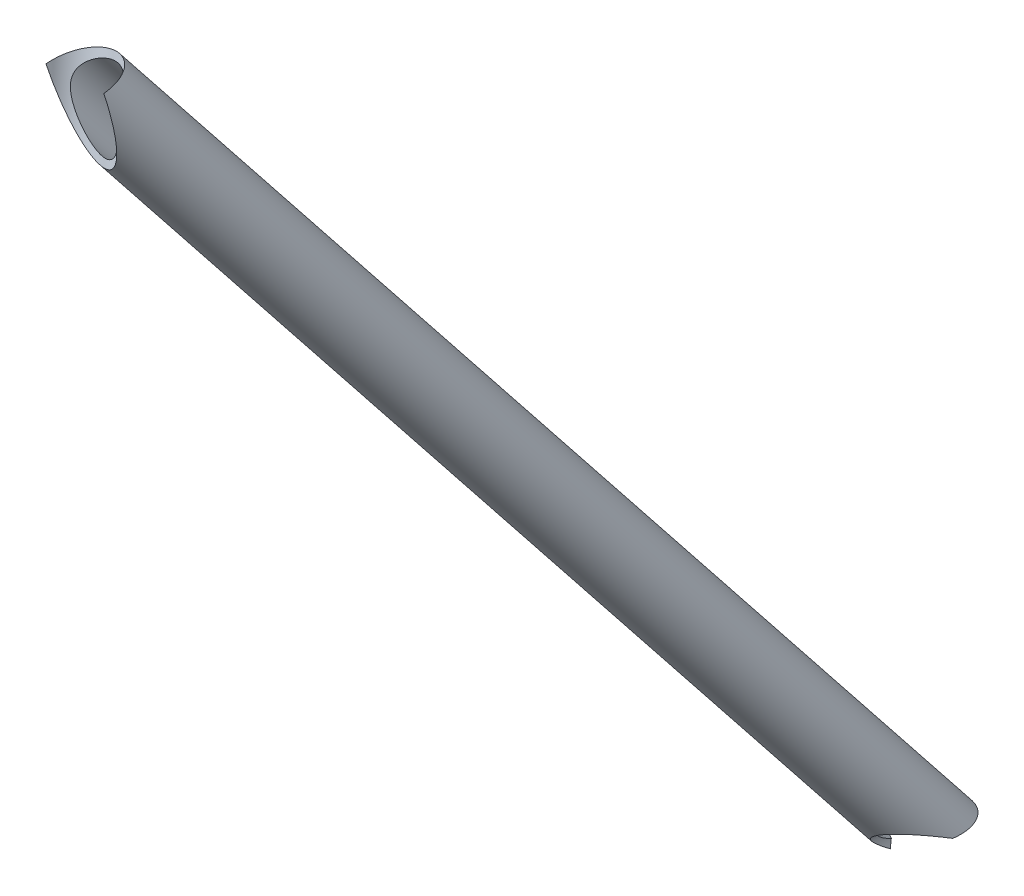
ISO-10303-21;
HEADER;
FILE_DESCRIPTION(('STEP AP214'),'2;1');
FILE_NAME('part.step','',(''),(''),'','','');
FILE_SCHEMA(('AUTOMOTIVE_DESIGN { 1 0 10303 214 1 1 1 1 }'));
ENDSEC;
DATA;
#1=APPLICATION_CONTEXT('core data for automotive mechanical design processes');
#2=APPLICATION_PROTOCOL_DEFINITION('international standard','automotive_design',2000,#1);
#3=PRODUCT_CONTEXT('',#1,'mechanical');
#4=PRODUCT('Part','Part','',(#3));
#5=PRODUCT_RELATED_PRODUCT_CATEGORY('part','',(#4));
#6=PRODUCT_DEFINITION_FORMATION('','',#4);
#7=PRODUCT_DEFINITION_CONTEXT('part definition',#1,'design');
#8=PRODUCT_DEFINITION('design','',#6,#7);
#9=PRODUCT_DEFINITION_SHAPE('','',#8);
#10=(LENGTH_UNIT() NAMED_UNIT(*) SI_UNIT(.MILLI.,.METRE.));
#11=(NAMED_UNIT(*) PLANE_ANGLE_UNIT() SI_UNIT($,.RADIAN.));
#12=(NAMED_UNIT(*) SI_UNIT($,.STERADIAN.) SOLID_ANGLE_UNIT());
#13=UNCERTAINTY_MEASURE_WITH_UNIT(LENGTH_MEASURE(1.E-05),#10,'distance_accuracy_value','');
#14=(GEOMETRIC_REPRESENTATION_CONTEXT(3) GLOBAL_UNCERTAINTY_ASSIGNED_CONTEXT((#13)) GLOBAL_UNIT_ASSIGNED_CONTEXT((#10,
#11,#12)) REPRESENTATION_CONTEXT('',''));
#15=CARTESIAN_POINT('',(0.,0.,0.));
#16=DIRECTION('',(0.,0.,1.));
#17=DIRECTION('',(1.,0.,0.));
#18=AXIS2_PLACEMENT_3D('',#15,#16,#17);
#19=CARTESIAN_POINT('',(250.000000000002,220.000000000001,-2000.));
#20=DIRECTION('',(-0.220873286514712,0.785327240941148,0.578339101168124));
#21=DIRECTION('',(0.,-0.592984323970814,0.805214003557363));
#22=AXIS2_PLACEMENT_3D('',#19,#20,#21);
#23=CYLINDRICAL_SURFACE('',#22,7.90000000000002);
#24=CARTESIAN_POINT('',(186.642858966305,440.585258627095,-1827.74318398322));
#25=CARTESIAN_POINT('',(186.752428093397,440.605161627123,-1827.72852719438));
#26=CARTESIAN_POINT('',(186.860994969299,440.630064497735,-1827.71317177304));
#27=CARTESIAN_POINT('',(187.07526867984,440.68955100044,-1827.68120657467));
#28=CARTESIAN_POINT('',(187.180974465447,440.724138131963,-1827.66459634582));
#29=CARTESIAN_POINT('',(187.492691346244,440.841693097054,-1827.61312517711));
#30=CARTESIAN_POINT('',(187.693347526773,440.938463025471,-1827.57661761688));
#31=CARTESIAN_POINT('',(188.122282758854,441.189402713712,-1827.4916226761));
#32=CARTESIAN_POINT('',(188.345514707554,441.351793041307,-1827.44237262172));
#33=CARTESIAN_POINT('',(188.76238209019,441.710458701126,-1827.34190864548));
#34=CARTESIAN_POINT('',(188.955954418355,441.906804441614,-1827.29069081849));
#35=CARTESIAN_POINT('',(189.280328319921,442.282079806857,-1827.19805233085));
#36=CARTESIAN_POINT('',(189.416002710456,442.456907681934,-1827.15667426444));
#37=CARTESIAN_POINT('',(189.671458997917,442.817986799844,-1827.0742492467));
#38=CARTESIAN_POINT('',(189.791230414787,443.004245458522,-1827.0332025303));
#39=CARTESIAN_POINT('',(190.016683336826,443.385460485637,-1826.95180289924));
#40=CARTESIAN_POINT('',(190.122348517796,443.580426588469,-1826.91145083467));
#41=CARTESIAN_POINT('',(190.321101399643,443.976915569887,-1826.83174161313));
#42=CARTESIAN_POINT('',(190.414184223835,444.178440953391,-1826.79238484671));
#43=CARTESIAN_POINT('',(190.586835745881,444.581156361001,-1826.71590996645));
#44=CARTESIAN_POINT('',(190.666694522571,444.782216949459,-1826.67876021794));
#45=CARTESIAN_POINT('',(190.816858261714,445.188059978178,-1826.60579541799));
#46=CARTESIAN_POINT('',(190.887164547591,445.392841898412,-1826.56998018216));
#47=CARTESIAN_POINT('',(191.019224980943,445.805595299622,-1826.49980724706));
#48=CARTESIAN_POINT('',(191.080971067105,446.013569584976,-1826.46545094253));
#49=CARTESIAN_POINT('',(191.196611597481,446.431963748182,-1826.3983980348));
#50=CARTESIAN_POINT('',(191.250505121511,446.642383909534,-1826.36570162641));
#51=CARTESIAN_POINT('',(191.40196464391,447.278945076008,-1826.27002114591));
#52=CARTESIAN_POINT('',(191.488606648467,447.708133373777,-1826.20983108325));
#53=CARTESIAN_POINT('',(191.636896026196,448.571647283601,-1826.09874281159));
#54=CARTESIAN_POINT('',(191.698557965261,449.005969749409,-1826.04783919721));
#55=CARTESIAN_POINT('',(191.777848498178,449.689899606742,-1825.97734724358));
#56=CARTESIAN_POINT('',(191.802991981959,449.938250615632,-1825.95373042853));
#57=CARTESIAN_POINT('',(191.846463748032,450.435951762374,-1825.91100203436));
#58=CARTESIAN_POINT('',(191.864791807766,450.685301932586,-1825.89189060238));
#59=CARTESIAN_POINT('',(191.894900482616,451.185115160938,-1825.85898282421));
#60=CARTESIAN_POINT('',(191.906671545637,451.435579309672,-1825.84519424116));
#61=CARTESIAN_POINT('',(191.923752217785,451.936997115486,-1825.82405460314));
#62=CARTESIAN_POINT('',(191.929062150724,452.187950747402,-1825.81670322555));
#63=CARTESIAN_POINT('',(191.933196444197,452.688032524648,-1825.80987028865));
#64=CARTESIAN_POINT('',(191.932072187403,452.937159268125,-1825.81032643757));
#65=CARTESIAN_POINT('',(191.923280107894,453.435186210419,-1825.82075087455));
#66=CARTESIAN_POINT('',(191.91561078373,453.684086344135,-1825.83072134527));
#67=CARTESIAN_POINT('',(191.893356060565,454.180226765289,-1825.8624721546));
#68=CARTESIAN_POINT('',(191.878788242715,454.427469660925,-1825.88422249177));
#69=CARTESIAN_POINT('',(191.842059061676,454.919581551793,-1825.94247168153));
#70=CARTESIAN_POINT('',(191.81990289174,455.164452053079,-1825.97896045061));
#71=CARTESIAN_POINT('',(191.775189258917,455.573923011248,-1826.05602691041));
#72=CARTESIAN_POINT('',(191.754923464304,455.739681562544,-1826.09175859526));
#73=CARTESIAN_POINT('',(191.709792355637,456.068148188384,-1826.17321203258));
#74=CARTESIAN_POINT('',(191.684926695434,456.230856032341,-1826.21893453692));
#75=CARTESIAN_POINT('',(191.630093862643,456.551377407496,-1826.32146851241));
#76=CARTESIAN_POINT('',(191.600141424792,456.709203560939,-1826.3782480228));
#77=CARTESIAN_POINT('',(191.534438093945,457.018707171362,-1826.50396071448));
#78=CARTESIAN_POINT('',(191.498688638488,457.170386141089,-1826.57289088303));
#79=CARTESIAN_POINT('',(191.426917298777,457.442239649155,-1826.71140113961));
#80=CARTESIAN_POINT('',(191.391836634665,457.563597217977,-1826.77914666357));
#81=CARTESIAN_POINT('',(191.31675654061,457.799416115064,-1826.92335938107));
#82=CARTESIAN_POINT('',(191.276757651573,457.913878199635,-1826.99982561545));
#83=CARTESIAN_POINT('',(191.191547338536,458.134946631106,-1827.16089112805));
#84=CARTESIAN_POINT('',(191.146333768461,458.241549713875,-1827.24549375236));
#85=CARTESIAN_POINT('',(191.0505233585,458.446136265069,-1827.42177927405));
#86=CARTESIAN_POINT('',(190.999926204699,458.544119230248,-1827.51346258421));
#87=CARTESIAN_POINT('',(190.893496183813,458.730696016765,-1827.70218343829));
#88=CARTESIAN_POINT('',(190.837687269535,458.819329157464,-1827.79919571789));
#89=CARTESIAN_POINT('',(190.72063263225,458.987698272343,-1827.99753701967));
#90=CARTESIAN_POINT('',(190.659386945841,459.067434306404,-1828.09886601279));
#91=CARTESIAN_POINT('',(190.531416862332,459.218373906312,-1828.30458178351));
#92=CARTESIAN_POINT('',(190.464686275678,459.289567603294,-1828.40897192771));
#93=CARTESIAN_POINT('',(190.325861513536,459.423780351402,-1828.61944069093));
#94=CARTESIAN_POINT('',(190.253766080016,459.486797475596,-1828.72551970138));
#95=CARTESIAN_POINT('',(190.071510723227,459.631147696164,-1828.98486450651));
#96=CARTESIAN_POINT('',(189.958520540455,459.708397699271,-1829.13842760681));
#97=CARTESIAN_POINT('',(189.72187837651,459.848724190113,-1829.44382514406));
#98=CARTESIAN_POINT('',(189.598222555494,459.911795543529,-1829.59565893598));
#99=CARTESIAN_POINT('',(189.34047580179,460.025305643242,-1829.89539680413));
#100=CARTESIAN_POINT('',(189.206374681417,460.075731848834,-1830.04329685021));
#101=CARTESIAN_POINT('',(188.92825607424,460.165141546437,-1830.33306202265));
#102=CARTESIAN_POINT('',(188.784239561336,460.20412616028,-1830.47492773948));
#103=CARTESIAN_POINT('',(188.48447663721,460.272222088195,-1830.75310693114));
#104=CARTESIAN_POINT('',(188.328584900256,460.301173862112,-1830.88930282558));
#105=CARTESIAN_POINT('',(188.007634390643,460.349251122525,-1831.15230606339));
#106=CARTESIAN_POINT('',(187.842575485993,460.368376467496,-1831.27911327151));
#107=CARTESIAN_POINT('',(187.504045154702,460.397503633442,-1831.52197072124));
#108=CARTESIAN_POINT('',(187.330576794119,460.407508753659,-1831.63802483911));
#109=CARTESIAN_POINT('',(186.975982975714,460.418982509829,-1831.85824995431));
#110=CARTESIAN_POINT('',(186.794857478529,460.420451101893,-1831.96242089054));
#111=CARTESIAN_POINT('',(186.412428566776,460.415141725747,-1832.16495740433));
#112=CARTESIAN_POINT('',(186.210616026598,460.407755774126,-1832.262348633));
#113=CARTESIAN_POINT('',(185.800514768925,460.384204944894,-1832.44115284055));
#114=CARTESIAN_POINT('',(185.59222571243,460.368039607013,-1832.52256498139));
#115=CARTESIAN_POINT('',(185.17058194869,460.327358617794,-1832.66850631995));
#116=CARTESIAN_POINT('',(184.957226758818,460.302842167893,-1832.73303390206));
#117=CARTESIAN_POINT('',(184.527018672459,460.245843010005,-1832.84449935656));
#118=CARTESIAN_POINT('',(184.310165905461,460.21336059631,-1832.89143787858));
#119=CARTESIAN_POINT('',(183.880813829899,460.141811437137,-1832.96618294119));
#120=CARTESIAN_POINT('',(183.668367043396,460.102959209749,-1832.99449755499));
#121=CARTESIAN_POINT('',(183.243254440462,460.01834447876,-1833.0338904696));
#122=CARTESIAN_POINT('',(183.030588627774,459.972582091369,-1833.04496906022));
#123=CARTESIAN_POINT('',(182.606636186311,459.874397863477,-1833.04990420065));
#124=CARTESIAN_POINT('',(182.395349350116,459.821977049967,-1833.04376340329));
#125=CARTESIAN_POINT('',(181.975679402989,459.710663422325,-1833.01449700923));
#126=CARTESIAN_POINT('',(181.767296298213,459.651770594471,-1832.99137137652));
#127=CARTESIAN_POINT('',(181.356461518591,459.528090714676,-1832.92880468245));
#128=CARTESIAN_POINT('',(181.153977778499,459.46334952741,-1832.8894832123));
#129=CARTESIAN_POINT('',(180.754833116257,459.327652123196,-1832.79516223278));
#130=CARTESIAN_POINT('',(180.558172180235,459.256695921057,-1832.74016276077));
#131=CARTESIAN_POINT('',(180.171981690002,459.108458564598,-1832.61526472582));
#132=CARTESIAN_POINT('',(179.982455691425,459.031174316099,-1832.54535884708));
#133=CARTESIAN_POINT('',(179.612000606068,458.870095053704,-1832.39165610984));
#134=CARTESIAN_POINT('',(179.431071588284,458.786299987568,-1832.30785913987));
#135=CARTESIAN_POINT('',(179.073868586318,458.609186217959,-1832.12484602267));
#136=CARTESIAN_POINT('',(178.897896900505,458.515657275658,-1832.02524284387));
#137=CARTESIAN_POINT('',(178.557946768245,458.320587948659,-1831.81405835545));
#138=CARTESIAN_POINT('',(178.393969811074,458.219046572374,-1831.70247556265));
#139=CARTESIAN_POINT('',(178.079617659338,458.007032032474,-1831.46920725414));
#140=CARTESIAN_POINT('',(177.929238341606,457.896561595761,-1831.34752482252));
#141=CARTESIAN_POINT('',(177.643715106251,457.665400369748,-1831.09627771351));
#142=CARTESIAN_POINT('',(177.508566258001,457.544712910336,-1830.96671560807));
#143=CARTESIAN_POINT('',(177.289091758784,457.325311175641,-1830.73775104678));
#144=CARTESIAN_POINT('',(177.200820639719,457.229313217939,-1830.63951345762));
#145=CARTESIAN_POINT('',(177.034253314478,457.030325262109,-1830.44169291567));
#146=CARTESIAN_POINT('',(176.95595445116,456.927337137796,-1830.34211032912));
#147=CARTESIAN_POINT('',(176.81027178925,456.713942918263,-1830.14337918577));
#148=CARTESIAN_POINT('',(176.74286744085,456.603551358012,-1830.04423016331));
#149=CARTESIAN_POINT('',(176.619572580637,456.374733484093,-1829.84801829283));
#150=CARTESIAN_POINT('',(176.563681985917,456.256307228288,-1829.75095542977));
#151=CARTESIAN_POINT('',(176.463525089334,456.010029853818,-1829.55992891086));
#152=CARTESIAN_POINT('',(176.419385867028,455.882093448389,-1829.46600804184));
#153=CARTESIAN_POINT('',(176.343841083295,455.618288824543,-1829.2843895339));
#154=CARTESIAN_POINT('',(176.312434319414,455.482421356522,-1829.19669130797));
#155=CARTESIAN_POINT('',(176.262219611295,455.203674517758,-1829.02924436516));
#156=CARTESIAN_POINT('',(176.243409649362,455.060796273905,-1828.94949437692));
#157=CARTESIAN_POINT('',(176.217736464523,454.769320545757,-1828.79905356782));
#158=CARTESIAN_POINT('',(176.210874697655,454.620722366671,-1828.72836385204));
#159=CARTESIAN_POINT('',(176.207900083172,454.303096391433,-1828.58938626054));
#160=CARTESIAN_POINT('',(176.213021800671,454.133589423054,-1828.52217314513));
#161=CARTESIAN_POINT('',(176.234908760222,453.791286656262,-1828.39905336804));
#162=CARTESIAN_POINT('',(176.251676552492,453.618490145578,-1828.34314918621));
#163=CARTESIAN_POINT('',(176.29516909483,453.270769556212,-1828.24155997147));
#164=CARTESIAN_POINT('',(176.32191689158,453.095841466698,-1828.19589898691));
#165=CARTESIAN_POINT('',(176.383833020134,452.745297771199,-1828.11366818849));
#166=CARTESIAN_POINT('',(176.419005280715,452.569681882155,-1828.07710263259));
#167=CARTESIAN_POINT('',(176.495379780514,452.223666821107,-1828.01271410454));
#168=CARTESIAN_POINT('',(176.536379171063,452.053263077795,-1827.98466966503));
#169=CARTESIAN_POINT('',(176.624201888152,451.713094101329,-1827.93482347983));
#170=CARTESIAN_POINT('',(176.671024310789,451.543328773279,-1827.91302076697));
#171=CARTESIAN_POINT('',(176.769847170013,451.20455033451,-1827.87464499769));
#172=CARTESIAN_POINT('',(176.821852573148,451.03553811061,-1827.85807702204));
#173=CARTESIAN_POINT('',(176.930486513364,450.698619749656,-1827.82935483573));
#174=CARTESIAN_POINT('',(176.987115625698,450.530713753049,-1827.81720117529));
#175=CARTESIAN_POINT('',(177.16395416973,450.027092755485,-1827.7861443965));
#176=CARTESIAN_POINT('',(177.290582268134,449.693273067514,-1827.77283281665));
#177=CARTESIAN_POINT('',(177.55881620358,449.03172310243,-1827.75653061142));
#178=CARTESIAN_POINT('',(177.700415070275,448.703990074221,-1827.75353520449));
#179=CARTESIAN_POINT('',(177.97261129307,448.110111169178,-1827.75457256744));
#180=CARTESIAN_POINT('',(178.101001438905,447.842947202599,-1827.75749950363));
#181=CARTESIAN_POINT('',(178.367512472577,447.313548514546,-1827.76688093592));
#182=CARTESIAN_POINT('',(178.505634270515,447.051314257011,-1827.77333576234));
#183=CARTESIAN_POINT('',(178.791953158901,446.532014593434,-1827.78865633965));
#184=CARTESIAN_POINT('',(178.94016348694,446.274956575271,-1827.79752530583));
#185=CARTESIAN_POINT('',(179.246882083768,445.767125468946,-1827.8167197384));
#186=CARTESIAN_POINT('',(179.405389670923,445.516351966295,-1827.82704510844));
#187=CARTESIAN_POINT('',(179.7319862024,445.024073199504,-1827.84822199712));
#188=CARTESIAN_POINT('',(179.899986413564,444.782509006585,-1827.85906853516));
#189=CARTESIAN_POINT('',(180.247576701284,444.307755132984,-1827.88058850042));
#190=CARTESIAN_POINT('',(180.427168891376,444.074566991619,-1827.89126189563));
#191=CARTESIAN_POINT('',(180.798545643458,443.618867640966,-1827.91162210433));
#192=CARTESIAN_POINT('',(180.990302927331,443.396334379432,-1827.92131100664));
#193=CARTESIAN_POINT('',(181.387545483843,442.963890909218,-1827.93887530518));
#194=CARTESIAN_POINT('',(181.593023046664,442.753973735135,-1827.94675170903));
#195=CARTESIAN_POINT('',(181.926538400246,442.437928834734,-1827.95688848704));
#196=CARTESIAN_POINT('',(182.049403786919,442.326356548642,-1827.96010169939));
#197=CARTESIAN_POINT('',(182.300301329639,442.109123852956,-1827.96542459375));
#198=CARTESIAN_POINT('',(182.42833345134,442.003463404073,-1827.96753428309));
#199=CARTESIAN_POINT('',(182.690050483792,441.798879031254,-1827.9704187369));
#200=CARTESIAN_POINT('',(182.823744433493,441.699966592122,-1827.97119127749));
#201=CARTESIAN_POINT('',(183.096829825542,441.510297305192,-1827.97112692867));
#202=CARTESIAN_POINT('',(183.236221337259,441.419540556733,-1827.97029001966));
#203=CARTESIAN_POINT('',(183.522734273044,441.246551921303,-1827.96668053804));
#204=CARTESIAN_POINT('',(183.669933485407,441.164448486642,-1827.96388254111));
#205=CARTESIAN_POINT('',(183.970341056391,441.012043864408,-1827.9559731305));
#206=CARTESIAN_POINT('',(184.123550246751,440.941744317569,-1827.95086139558));
#207=CARTESIAN_POINT('',(184.435192874333,440.815371288616,-1827.93797012179));
#208=CARTESIAN_POINT('',(184.593611053662,440.759259827326,-1827.93019783909));
#209=CARTESIAN_POINT('',(184.915182547543,440.663531831656,-1827.9116227321));
#210=CARTESIAN_POINT('',(185.078332843981,440.623905020616,-1827.90082180296));
#211=CARTESIAN_POINT('',(185.358855081219,440.572588531476,-1827.87960937101));
#212=CARTESIAN_POINT('',(185.475420483615,440.556095989463,-1827.87003628917));
#213=CARTESIAN_POINT('',(185.70938011646,440.533248401992,-1827.84919525914));
#214=CARTESIAN_POINT('',(185.826774069146,440.52689010751,-1827.83792785541));
#215=CARTESIAN_POINT('',(186.061360934894,440.524901183724,-1827.81369998508));
#216=CARTESIAN_POINT('',(186.178553927816,440.52925890918,-1827.80074137084));
#217=CARTESIAN_POINT('',(186.411818739849,440.548995870663,-1827.7731728686));
#218=CARTESIAN_POINT('',(186.527890583619,440.564374863716,-1827.75856301701));
#219=CARTESIAN_POINT('',(186.642858966305,440.585258627095,-1827.74318398322));
#220=B_SPLINE_CURVE_WITH_KNOTS('',3,(#24,#25,#26,#27,#28,#29,#30,#31,#32,#33,#34,#35,#36,#37,
#38,#39,#40,#41,#42,#43,#44,#45,#46,#47,#48,#49,#50,#51,#52,#53,#54,#55,#56,#57,#58,#59,#60,#61,
#62,#63,#64,#65,#66,#67,#68,#69,#70,#71,#72,#73,#74,#75,#76,#77,#78,#79,#80,#81,#82,#83,#84,#85,
#86,#87,#88,#89,#90,#91,#92,#93,#94,#95,#96,#97,#98,#99,#100,#101,#102,#103,#104,#105,#106,#107,
#108,#109,#110,#111,#112,#113,#114,#115,#116,#117,#118,#119,#120,#121,#122,#123,#124,#125,#126,
#127,#128,#129,#130,#131,#132,#133,#134,#135,#136,#137,#138,#139,#140,#141,#142,#143,#144,#145,
#146,#147,#148,#149,#150,#151,#152,#153,#154,#155,#156,#157,#158,#159,#160,#161,#162,#163,#164,
#165,#166,#167,#168,#169,#170,#171,#172,#173,#174,#175,#176,#177,#178,#179,#180,#181,#182,#183,
#184,#185,#186,#187,#188,#189,#190,#191,#192,#193,#194,#195,#196,#197,#198,#199,#200,#201,#202,
#203,#204,#205,#206,#207,#208,#209,#210,#211,#212,#213,#214,#215,#216,#217,#218,#219),
.UNSPECIFIED.,.T.,.F.,(4,2,2,2,2,2,2,2,2,2,2,2,2,2,2,2,2,2,2,2,2,2,2,2,2,2,2,2,2,2,2,2,2,2,2,2,
2,2,2,2,2,2,2,2,2,2,2,2,2,2,2,2,2,2,2,2,2,2,2,2,2,2,2,2,2,2,2,2,2,2,2,2,2,2,2,2,2,2,2,2,2,2,2,2,
2,2,2,2,2,2,2,2,2,2,2,2,2,4),(0.,0.336840989323387,0.673803854309978,1.34759135190776,
2.18424726716013,3.02265930048108,3.69713046898443,4.37204393082849,5.04773177676874,
5.72368076031018,6.38192735394287,7.04008265941308,7.69885361293995,8.35770170108503,
9.6825560321899,11.006636724007,11.7587263785664,12.5108405904088,13.2640476201482,
14.01721689997,14.7643798963346,15.511714339159,16.257154330341,17.0020851795604,
17.5140905159853,18.0261343975515,18.5367195931108,19.0471783672481,19.4767323542733,
19.9062391412155,20.3359233246091,20.7656325765667,21.1934559411627,21.6212764261042,
22.0495865029481,22.4779973349059,23.0942381699182,23.7107017974741,24.3277744003737,
24.9447864799412,25.5712027492475,26.1976280402872,26.8238266317871,27.4500284427923,
28.1218066818187,28.7936201430302,29.4654978634875,30.137350766136,30.790017577673,
31.4426734143248,32.095228707772,32.7477853847514,33.395607545099,34.0434281619442,
34.6915674525793,35.339711944067,36.007292881715,36.6749565665391,37.3424171141943,
38.009660957377,38.4990736632176,38.9883556892365,39.4767037545551,39.9650483032875,
40.4584770499629,40.9518591863692,41.4451622762421,41.9385254771169,42.4849155357643,
43.031425278852,43.579204959793,44.1272405987518,44.6594919946155,45.1916608724288,
45.7243446914621,46.2570948852017,47.328238149135,48.3988848698922,49.2879471888221,
50.177092763356,51.0674283922845,51.9577051446897,52.8407176074603,53.7238915249486,
54.6051506579685,55.4859186872294,55.9837507879408,56.4815795798068,56.9802355412719,
57.4788975757878,57.984147002715,58.4894666010458,58.993418869918,59.4970564984764,
59.8510016882762,60.2048333809435,60.5582807300142,60.9117202872412),.UNSPECIFIED.);
#221=CARTESIAN_POINT('',(186.642858966305,440.585258627095,-1827.74318398322));
#222=VERTEX_POINT('',#221);
#223=EDGE_CURVE('E111',#222,#222,#220,.T.);
#224=ORIENTED_EDGE('',*,*,#223,.T.);
#225=EDGE_LOOP('',(#224));
#226=FACE_BOUND('',#225,.T.);
#227=CARTESIAN_POINT('',(245.807312143982,230.222758439814,-1982.66059030163));
#228=CARTESIAN_POINT('',(245.624410447176,229.998344097819,-1982.82585276794));
#229=CARTESIAN_POINT('',(245.452957899156,229.77439989533,-1983.00426039845));
#230=CARTESIAN_POINT('',(245.128924377079,229.329186195667,-1983.38071745754));
#231=CARTESIAN_POINT('',(244.976362792528,229.107919653515,-1983.57878669715));
#232=CARTESIAN_POINT('',(244.68633497429,228.667994216839,-1983.99122163359));
#233=CARTESIAN_POINT('',(244.548958124841,228.449356884022,-1984.20567243438));
#234=CARTESIAN_POINT('',(244.287840277746,228.01666355135,-1984.64681958413));
#235=CARTESIAN_POINT('',(244.164093290487,227.802605572699,-1984.8735104884));
#236=CARTESIAN_POINT('',(243.921637739096,227.367696857351,-1985.35007679693));
#237=CARTESIAN_POINT('',(243.80358791348,227.147126609061,-1985.60054089134));
#238=CARTESIAN_POINT('',(243.578476079433,226.711964157807,-1986.11146425207));
#239=CARTESIAN_POINT('',(243.471416369794,226.497373212339,-1986.37192559392));
#240=CARTESIAN_POINT('',(243.266587547917,226.074493138244,-1986.90225336215));
#241=CARTESIAN_POINT('',(243.168834662204,225.866215432555,-1987.17213513302));
#242=CARTESIAN_POINT('',(242.981507055761,225.457229555957,-1987.72028714));
#243=CARTESIAN_POINT('',(242.891931493626,225.256520607512,-1987.99855650914));
#244=CARTESIAN_POINT('',(242.71999271249,224.864373279645,-1988.56257683179));
#245=CARTESIAN_POINT('',(242.637611203844,224.672911979097,-1988.84830626255));
#246=CARTESIAN_POINT('',(242.478700164398,224.300383300671,-1989.42815729349));
#247=CARTESIAN_POINT('',(242.402171812205,224.119318017981,-1989.72228056758));
#248=CARTESIAN_POINT('',(242.254116007919,223.77053100784,-1990.31872477327));
#249=CARTESIAN_POINT('',(242.182578395252,223.602782067709,-1990.62102720041));
#250=CARTESIAN_POINT('',(242.043389540983,223.284018782331,-1991.23512322047));
#251=CARTESIAN_POINT('',(241.975736332427,223.132995930827,-1991.54691188526));
#252=CARTESIAN_POINT('',(241.866194795075,222.901395553901,-1992.07227264414));
#253=CARTESIAN_POINT('',(241.823430888273,222.814426893828,-1992.28283770838));
#254=CARTESIAN_POINT('',(241.739099254348,222.652500456568,-1992.70888227772));
#255=CARTESIAN_POINT('',(241.69753177973,222.577545199739,-1992.92436280326));
#256=CARTESIAN_POINT('',(241.615818896484,222.442903074455,-1993.35947009389));
#257=CARTESIAN_POINT('',(241.575668807538,222.383160900979,-1993.5790786311));
#258=CARTESIAN_POINT('',(241.497032277611,222.282311120361,-1994.02284071867));
#259=CARTESIAN_POINT('',(241.45854491899,222.241193112778,-1994.24699165913));
#260=CARTESIAN_POINT('',(241.396337623587,222.191479286646,-1994.62496080986));
#261=CARTESIAN_POINT('',(241.371899739251,222.176647820829,-1994.77784196466));
#262=CARTESIAN_POINT('',(241.324710360892,222.158596838594,-1995.08452974639));
#263=CARTESIAN_POINT('',(241.301958266095,222.15537316575,-1995.23833602231));
#264=CARTESIAN_POINT('',(241.258812788155,222.161587827185,-1995.54587500464));
#265=CARTESIAN_POINT('',(241.238416812678,222.171012098558,-1995.69960760298));
#266=CARTESIAN_POINT('',(241.200765295529,222.203151127582,-1996.00608231863));
#267=CARTESIAN_POINT('',(241.183509702691,222.225865668667,-1996.15882445204));
#268=CARTESIAN_POINT('',(241.152974369996,222.284795213137,-1996.46280647461));
#269=CARTESIAN_POINT('',(241.139712689075,222.32106992327,-1996.61403663698));
#270=CARTESIAN_POINT('',(241.118188189392,222.406543497247,-1996.91315747085));
#271=CARTESIAN_POINT('',(241.10992542735,222.455742507723,-1997.06104810444));
#272=CARTESIAN_POINT('',(241.099222934395,222.566032725547,-1997.35280149343));
#273=CARTESIAN_POINT('',(241.096792666454,222.627143085131,-1997.4966573294));
#274=CARTESIAN_POINT('',(241.098471307309,222.759715381203,-1997.77947023266));
#275=CARTESIAN_POINT('',(241.102581104961,222.831178723555,-1997.91842663145));
#276=CARTESIAN_POINT('',(241.119390892364,222.997852303446,-1998.21813264608));
#277=CARTESIAN_POINT('',(241.13363262241,223.094961461707,-1998.37774009978));
#278=CARTESIAN_POINT('',(241.172905362533,223.29888542536,-1998.68923133161));
#279=CARTESIAN_POINT('',(241.197938760517,223.405702374694,-1998.84111339201));
#280=CARTESIAN_POINT('',(241.259203041516,223.626574907862,-1999.1373457416));
#281=CARTESIAN_POINT('',(241.295443866893,223.740636847214,-1999.2816892097));
#282=CARTESIAN_POINT('',(241.37931724949,223.973670805667,-1999.5628714048));
#283=CARTESIAN_POINT('',(241.426949291501,224.092642602502,-1999.69971047086));
#284=CARTESIAN_POINT('',(241.534672045184,224.335819707672,-1999.96855603688));
#285=CARTESIAN_POINT('',(241.594978139845,224.460081209685,-2000.10042518905));
#286=CARTESIAN_POINT('',(241.727450408546,224.709948177971,-2000.35670946677));
#287=CARTESIAN_POINT('',(241.799616531795,224.835553638486,-2000.48112462424));
#288=CARTESIAN_POINT('',(241.955660950714,225.086550126954,-2000.72252897153));
#289=CARTESIAN_POINT('',(242.039536298277,225.211941200866,-2000.83952001981));
#290=CARTESIAN_POINT('',(242.218794720544,225.461193341735,-2001.06608502021));
#291=CARTESIAN_POINT('',(242.314178384025,225.585054330053,-2001.17565859239));
#292=CARTESIAN_POINT('',(242.531968807456,225.849220739282,-2001.40385789128));
#293=CARTESIAN_POINT('',(242.656268523652,225.989066096806,-2001.52121659629));
#294=CARTESIAN_POINT('',(242.91925124868,226.263428505782,-2001.74562239388));
#295=CARTESIAN_POINT('',(243.057935610429,226.397945054397,-2001.8526685147));
#296=CARTESIAN_POINT('',(243.348957003794,226.660203187838,-2002.0561340557));
#297=CARTESIAN_POINT('',(243.501298505471,226.787942532509,-2002.15254997337));
#298=CARTESIAN_POINT('',(243.81865910206,227.035280685873,-2002.3343151419));
#299=CARTESIAN_POINT('',(243.983677872882,227.154879702523,-2002.41966467553));
#300=CARTESIAN_POINT('',(244.32583856651,227.385151845903,-2002.57912055417));
#301=CARTESIAN_POINT('',(244.503016032378,227.495796547017,-2002.65319170497));
#302=CARTESIAN_POINT('',(244.86781114807,227.706779040902,-2002.78934291321));
#303=CARTESIAN_POINT('',(245.05542889957,227.807116733268,-2002.85142285385));
#304=CARTESIAN_POINT('',(245.439717983171,227.99668721028,-2002.96315808781));
#305=CARTESIAN_POINT('',(245.636388008455,228.085921590995,-2003.01281516792));
#306=CARTESIAN_POINT('',(246.037345315893,228.252719389216,-2003.09931047411));
#307=CARTESIAN_POINT('',(246.241632514585,228.330282934554,-2003.13614884061));
#308=CARTESIAN_POINT('',(246.653497888212,228.472407893981,-2003.19621688096));
#309=CARTESIAN_POINT('',(246.86099502949,228.53712992402,-2003.21962266026));
#310=CARTESIAN_POINT('',(247.28037040048,228.654709911369,-2003.25323029953));
#311=CARTESIAN_POINT('',(247.492248603865,228.70756793995,-2003.26343223882));
#312=CARTESIAN_POINT('',(247.918866627575,228.801504110585,-2003.27028079517));
#313=CARTESIAN_POINT('',(248.133607114182,228.842579457927,-2003.26692419915));
#314=CARTESIAN_POINT('',(248.564303660048,228.913235684803,-2003.2462776504));
#315=CARTESIAN_POINT('',(248.780259722865,228.942816530683,-2003.22898765688));
#316=CARTESIAN_POINT('',(249.214687422478,228.991355438234,-2003.17972726281));
#317=CARTESIAN_POINT('',(249.433153591979,229.010164461905,-2003.14756153008));
#318=CARTESIAN_POINT('',(249.867964457336,229.037384934472,-2003.06797338859));
#319=CARTESIAN_POINT('',(250.084308992019,229.045795599415,-2003.02054982985));
#320=CARTESIAN_POINT('',(250.513072980222,229.053390964558,-2002.90981875144));
#321=CARTESIAN_POINT('',(250.725492283611,229.052575312601,-2002.84651062557));
#322=CARTESIAN_POINT('',(251.144456196129,229.043271034301,-2002.7032516687));
#323=CARTESIAN_POINT('',(251.351002022333,229.034784009714,-2002.62330431459));
#324=CARTESIAN_POINT('',(251.715900066539,229.014417751188,-2002.46348941358));
#325=CARTESIAN_POINT('',(251.875684575118,229.003545432161,-2002.38675216765));
#326=CARTESIAN_POINT('',(252.188875430056,228.979486234647,-2002.22153579599));
#327=CARTESIAN_POINT('',(252.342282995456,228.966299801074,-2002.13305892813));
#328=CARTESIAN_POINT('',(252.641111934178,228.939180498787,-2001.94407829473));
#329=CARTESIAN_POINT('',(252.786545760259,228.925248865239,-2001.84359410973));
#330=CARTESIAN_POINT('',(253.068136970845,228.898404653474,-2001.63023588294));
#331=CARTESIAN_POINT('',(253.204296162632,228.885491876641,-2001.51736426625));
#332=CARTESIAN_POINT('',(253.444428961392,228.864491255573,-2001.29871797514));
#333=CARTESIAN_POINT('',(253.550034587178,228.855960198979,-2001.19477713663));
#334=CARTESIAN_POINT('',(253.752660076463,228.842120535598,-2000.97865266732));
#335=CARTESIAN_POINT('',(253.849681728209,228.836811256282,-2000.86647076228));
#336=CARTESIAN_POINT('',(254.0342715413,228.830448725444,-2000.63462644792));
#337=CARTESIAN_POINT('',(254.121848239454,228.829391598707,-2000.51497095076));
#338=CARTESIAN_POINT('',(254.287105746534,228.832324439749,-2000.2690666188));
#339=CARTESIAN_POINT('',(254.364786377634,228.836314498208,-2000.14281766558));
#340=CARTESIAN_POINT('',(254.509881854607,228.849807469617,-1999.8852314995));
#341=CARTESIAN_POINT('',(254.577319945405,228.859297657025,-1999.75390668299));
#342=CARTESIAN_POINT('',(254.702317120804,228.88391116676,-1999.48716737246));
#343=CARTESIAN_POINT('',(254.759876052697,228.899034576153,-1999.35175281526));
#344=CARTESIAN_POINT('',(254.865650944199,228.934754557198,-1999.07791500258));
#345=CARTESIAN_POINT('',(254.913858836137,228.9553558189,-1998.93948926267));
#346=CARTESIAN_POINT('',(255.001589760041,229.001630321302,-1998.66072775665));
#347=CARTESIAN_POINT('',(255.041109769686,229.027305321164,-1998.52039134384));
#348=CARTESIAN_POINT('',(255.139320369595,229.104460793295,-1998.13153891878));
#349=CARTESIAN_POINT('',(255.189750958607,229.160722612072,-1997.88187213888));
#350=CARTESIAN_POINT('',(255.270632142664,229.284248927898,-1997.38201520549));
#351=CARTESIAN_POINT('',(255.301065338626,229.351522942911,-1997.13182478573));
#352=CARTESIAN_POINT('',(255.345768983142,229.494551698204,-1996.63118738846));
#353=CARTESIAN_POINT('',(255.35996061112,229.570345852149,-1996.38074501429));
#354=CARTESIAN_POINT('',(255.374812103245,229.727786898937,-1995.88144765262));
#355=CARTESIAN_POINT('',(255.375475741238,229.809432153146,-1995.63259224177));
#356=CARTESIAN_POINT('',(255.364673813772,229.989013883669,-1995.10016223855));
#357=CARTESIAN_POINT('',(255.351417115612,230.08758475717,-1994.81684216297));
#358=CARTESIAN_POINT('',(255.312155648314,230.287906297759,-1994.25217978953));
#359=CARTESIAN_POINT('',(255.28614775533,230.389657738314,-1993.97083799345));
#360=CARTESIAN_POINT('',(255.222808580958,230.594778356573,-1993.40968532397));
#361=CARTESIAN_POINT('',(255.185464823717,230.698149197049,-1993.12987648485));
#362=CARTESIAN_POINT('',(255.100394961318,230.905043230205,-1992.57193872117));
#363=CARTESIAN_POINT('',(255.052669837783,231.008566407562,-1992.29380964032));
#364=CARTESIAN_POINT('',(254.947511922455,231.214326468462,-1991.73987579818));
#365=CARTESIAN_POINT('',(254.890108042595,231.316566236105,-1991.46406661026));
#366=CARTESIAN_POINT('',(254.765697793822,231.519043125176,-1990.91386385935));
#367=CARTESIAN_POINT('',(254.698690934002,231.619280143925,-1990.63947036946));
#368=CARTESIAN_POINT('',(254.55508426936,231.816658325384,-1990.09237929658));
#369=CARTESIAN_POINT('',(254.478493268176,231.913802227884,-1989.81968039525));
#370=CARTESIAN_POINT('',(254.315380041002,232.104053399497,-1989.27587249247));
#371=CARTESIAN_POINT('',(254.228858992141,232.197161145264,-1989.00476330658));
#372=CARTESIAN_POINT('',(254.064694529893,232.359116783096,-1988.52137439671));
#373=CARTESIAN_POINT('',(253.989028670619,232.428938944202,-1988.30874915746));
#374=CARTESIAN_POINT('',(253.830783864519,232.564735994064,-1987.88483535901));
#375=CARTESIAN_POINT('',(253.748204900842,232.630710873442,-1987.67354680307));
#376=CARTESIAN_POINT('',(253.575345050372,232.758294334405,-1987.25188788291));
#377=CARTESIAN_POINT('',(253.485038889068,232.819887279189,-1987.04152309709));
#378=CARTESIAN_POINT('',(253.296339745773,232.937561170559,-1986.62289431519));
#379=CARTESIAN_POINT('',(253.197947252156,232.993642449573,-1986.41463019309));
#380=CARTESIAN_POINT('',(252.966666961696,233.11236788777,-1985.94924949964));
#381=CARTESIAN_POINT('',(252.831290656064,233.173168536191,-1985.6928827225));
#382=CARTESIAN_POINT('',(252.544644515105,233.281796293655,-1985.18597885402));
#383=CARTESIAN_POINT('',(252.393362890799,233.329613684154,-1984.93544625735));
#384=CARTESIAN_POINT('',(252.073553444042,233.40821515099,-1984.44488549627));
#385=CARTESIAN_POINT('',(251.905135875447,233.439100853817,-1984.20480280257));
#386=CARTESIAN_POINT('',(251.547811488479,233.479116642421,-1983.73872843589));
#387=CARTESIAN_POINT('',(251.35894745466,233.488291272795,-1983.51270883959));
#388=CARTESIAN_POINT('',(251.005262230269,233.479295850332,-1983.13301690869));
#389=CARTESIAN_POINT('',(250.845203295547,233.467038827352,-1982.97481564759));
#390=CARTESIAN_POINT('',(250.511113389797,233.422012639168,-1982.67658438072));
#391=CARTESIAN_POINT('',(250.337085610598,233.389248148278,-1982.53655024285));
#392=CARTESIAN_POINT('',(250.065890460661,233.321884493627,-1982.34491232542));
#393=CARTESIAN_POINT('',(249.973172573059,233.296169190503,-1982.28377080777));
#394=CARTESIAN_POINT('',(249.785127804651,233.238301483727,-1982.16905166782));
#395=CARTESIAN_POINT('',(249.689802341674,233.206152520494,-1982.11547002885));
#396=CARTESIAN_POINT('',(249.497303996214,233.135308856566,-1982.01686900243));
#397=CARTESIAN_POINT('',(249.400133209343,233.096621228004,-1981.97184047463));
#398=CARTESIAN_POINT('',(249.204725833289,233.012774006765,-1981.89107751423));
#399=CARTESIAN_POINT('',(249.106489380244,232.967615231972,-1981.8553419087));
#400=CARTESIAN_POINT('',(248.920314784641,232.876265551197,-1981.79694366717));
#401=CARTESIAN_POINT('',(248.832383339401,232.83068593342,-1981.77329969967));
#402=CARTESIAN_POINT('',(248.657167001411,232.735038809165,-1981.73398897373));
#403=CARTESIAN_POINT('',(248.569882327247,232.684969854204,-1981.71832480093));
#404=CARTESIAN_POINT('',(248.309987363499,232.528751238686,-1981.68323878263));
#405=CARTESIAN_POINT('',(248.139281098509,232.416562661289,-1981.67570643086));
#406=CARTESIAN_POINT('',(247.768132128921,232.153093965802,-1981.69111630146));
#407=CARTESIAN_POINT('',(247.570194441172,231.998840838674,-1981.721680184));
#408=CARTESIAN_POINT('',(247.191524483042,231.680610585308,-1981.81810278084));
#409=CARTESIAN_POINT('',(247.010827500486,231.516614584956,-1981.88403212913));
#410=CARTESIAN_POINT('',(246.647068197387,231.165342205069,-1982.05186903972));
#411=CARTESIAN_POINT('',(246.466057200131,230.977533259615,-1982.15700645799));
#412=CARTESIAN_POINT('',(246.123109095919,230.600624229455,-1982.39186927703));
#413=CARTESIAN_POINT('',(245.961160273475,230.411525014157,-1982.52157944628));
#414=CARTESIAN_POINT('',(245.807312143982,230.222758439814,-1982.66059030163));
#415=B_SPLINE_CURVE_WITH_KNOTS('',3,(#227,#228,#229,#230,#231,#232,#233,#234,#235,#236,#237,
#238,#239,#240,#241,#242,#243,#244,#245,#246,#247,#248,#249,#250,#251,#252,#253,#254,#255,#256,
#257,#258,#259,#260,#261,#262,#263,#264,#265,#266,#267,#268,#269,#270,#271,#272,#273,#274,#275,
#276,#277,#278,#279,#280,#281,#282,#283,#284,#285,#286,#287,#288,#289,#290,#291,#292,#293,#294,
#295,#296,#297,#298,#299,#300,#301,#302,#303,#304,#305,#306,#307,#308,#309,#310,#311,#312,#313,
#314,#315,#316,#317,#318,#319,#320,#321,#322,#323,#324,#325,#326,#327,#328,#329,#330,#331,#332,
#333,#334,#335,#336,#337,#338,#339,#340,#341,#342,#343,#344,#345,#346,#347,#348,#349,#350,#351,
#352,#353,#354,#355,#356,#357,#358,#359,#360,#361,#362,#363,#364,#365,#366,#367,#368,#369,#370,
#371,#372,#373,#374,#375,#376,#377,#378,#379,#380,#381,#382,#383,#384,#385,#386,#387,#388,#389,
#390,#391,#392,#393,#394,#395,#396,#397,#398,#399,#400,#401,#402,#403,#404,#405,#406,#407,#408,
#409,#410,#411,#412,#413,#414),.UNSPECIFIED.,.T.,.F.,(4,2,2,2,2,2,2,2,2,2,2,2,2,2,2,2,2,2,2,2,2,
2,2,2,2,2,2,2,2,2,2,2,2,2,2,2,2,2,2,2,2,2,2,2,2,2,2,2,2,2,2,2,2,2,2,2,2,2,2,2,2,2,2,2,2,2,2,2,2,
2,2,2,2,2,2,2,2,2,2,2,2,2,2,2,2,2,2,2,2,2,2,2,2,4),(0.,0.999705346146307,2.00042842157415,
3.00675947310227,4.0126465151992,5.07424953619927,6.13607416121491,7.19971742571962,
8.26325112308758,9.32399707060372,10.3849560531726,11.4436878894017,12.5018787979209,
13.1969850335459,13.8922369090983,14.5849240014325,15.2772237926951,15.7434358416092,
16.2094809364576,16.6750082774617,17.1405280328999,17.6081221341676,18.0757215407817,
18.54407909596,19.0125003106884,19.5738036861621,20.1352313267308,20.6971584581529,
21.2590601792028,21.831420135012,22.4037776396822,22.9759912972372,23.5482342422937,
24.2100327672512,24.8718935928779,25.5339718459273,26.1960331788523,26.8601199063224,
27.5242131022535,28.1882107261756,28.8522010767041,29.5072748231174,30.162344634175,
30.8175696917401,31.4727966676892,32.136882935471,32.8010192669614,33.4651809476618,
34.1292039857604,34.6615015957375,35.1936969772295,35.7250360471516,36.2562712808166,
36.7010628695016,37.145761578233,37.5900549171848,38.0343562386741,38.4776336694067,
38.9209179515425,39.3645829954676,39.8084021372086,40.5895551301994,41.3713868823298,
42.1569969975258,42.9423879514525,43.8428362094577,44.7435051738379,45.645168998851,
46.5467476028752,47.4456792782998,48.3446569237957,49.2428147813368,50.1408662792291,
50.8494701378047,51.5580757237176,52.2690947949376,52.9800709557173,53.8680992315472,
54.7567904147399,55.6400874530759,56.5215706540898,57.1961464508977,57.8705685460744,
58.212184815129,58.5536188897472,58.8946860098303,59.2357100605682,59.5407635046484,
59.845915730736,60.4560318903134,61.210317229067,61.9661147107933,62.8075387340319,
63.6484428931246),.UNSPECIFIED.);
#416=CARTESIAN_POINT('',(255.361082505998,230.000000000001,-1995.07106715428));
#417=VERTEX_POINT('',#416);
#418=CARTESIAN_POINT('',(242.333239024517,223.956928650387,-1990.));
#419=VERTEX_POINT('',#418);
#420=EDGE_CURVE('E103',#417,#419,#415,.T.);
#421=ORIENTED_EDGE('',*,*,#420,.T.);
#422=CARTESIAN_POINT('',(246.180903451479,233.579009950304,-1990.));
#423=DIRECTION('',(0.,0.,-1.));
#424=DIRECTION('',(-0.270745576918295,0.962650940153896,0.));
#425=AXIS2_PLACEMENT_3D('',#422,#423,#424);
#426=ELLIPSE('',#425,13.6598061311153,7.90000000000002);
#427=CARTESIAN_POINT('',(239.031263409851,230.000000000001,-1990.));
#428=VERTEX_POINT('',#427);
#429=EDGE_CURVE('E91',#419,#428,#426,.T.);
#430=ORIENTED_EDGE('',*,*,#429,.T.);
#431=CARTESIAN_POINT('',(247.187500000002,230.000000000001,-1992.63569285493));
#432=DIRECTION('',(0.,-1.,0.));
#433=DIRECTION('',(-0.356776144958636,0.,0.934189907025576));
#434=AXIS2_PLACEMENT_3D('',#431,#432,#433);
#435=ELLIPSE('',#434,10.0595007891646,7.90000000000002);
#436=EDGE_CURVE('E92',#428,#417,#435,.T.);
#437=ORIENTED_EDGE('',*,*,#436,.T.);
#438=EDGE_LOOP('',(#421,#430,#437));
#439=FACE_BOUND('',#438,.T.);
#440=ADVANCED_FACE('F41',(#226,#439),#23,.F.);
#441=CARTESIAN_POINT('',(250.000000000002,220.000000000001,-2000.));
#442=DIRECTION('',(-0.220873286514712,0.785327240941148,0.578339101168124));
#443=DIRECTION('',(0.,-0.592984323970814,0.805214003557363));
#444=AXIS2_PLACEMENT_3D('',#441,#442,#443);
#445=CYLINDRICAL_SURFACE('',#444,9.49999999999999);
#446=CARTESIAN_POINT('',(182.499999999998,460.,-1823.25662851831));
#447=DIRECTION('',(-0.199819499582881,0.963496880792615,0.178173870950114));
#448=DIRECTION('',(-0.0941135696446757,-0.199873167964145,0.975291419390488));
#449=AXIS2_PLACEMENT_3D('',#446,#447,#448);
#450=ELLIPSE('',#449,10.5107092437273,9.49999999999999);
#451=CARTESIAN_POINT('',(191.765372956575,461.692079811397,-1822.01576998996));
#452=VERTEX_POINT('',#451);
#453=CARTESIAN_POINT('',(173.234627043421,458.307920188603,-1824.49748704667));
#454=VERTEX_POINT('',#453);
#455=EDGE_CURVE('E112',#452,#454,#450,.T.);
#456=ORIENTED_EDGE('',*,*,#455,.F.);
#457=CARTESIAN_POINT('',(182.499999999998,460.,-1823.25662851831));
#458=DIRECTION('',(-0.0941135696446757,-0.199873167964145,0.975291419390488));
#459=DIRECTION('',(-0.199819499582881,0.963496880792615,0.178173870950114));
#460=AXIS2_PLACEMENT_3D('',#457,#458,#459);
#461=ELLIPSE('',#460,22.2029800153112,9.49999999999999);
#462=EDGE_CURVE('E65',#454,#452,#461,.T.);
#463=ORIENTED_EDGE('',*,*,#462,.F.);
#464=EDGE_LOOP('',(#456,#463));
#465=FACE_BOUND('',#464,.T.);
#466=CARTESIAN_POINT('',(246.180903451479,233.579009950304,-1990.));
#467=DIRECTION('',(0.,0.,-1.));
#468=DIRECTION('',(-0.270745576918295,0.962650940153896,0.));
#469=AXIS2_PLACEMENT_3D('',#466,#467,#468);
#470=ELLIPSE('',#469,16.426349145012,9.49999999999999);
#471=CARTESIAN_POINT('',(242.158832279335,221.30526066701,-1990.));
#472=VERTEX_POINT('',#471);
#473=CARTESIAN_POINT('',(237.339156533636,230.000000000001,-1990.));
#474=VERTEX_POINT('',#473);
#475=EDGE_CURVE('E84',#472,#474,#470,.T.);
#476=ORIENTED_EDGE('',*,*,#475,.F.);
#477=CARTESIAN_POINT('',(250.000000000002,220.000000000001,-2000.));
#478=DIRECTION('',(-0.502531728597143,0.714169641222543,-0.487261311114716));
#479=DIRECTION('',(-0.0269990666169515,0.550356907278937,0.834492854979704));
#480=AXIS2_PLACEMENT_3D('',#477,#478,#479);
#481=ELLIPSE('',#480,24.3558243593633,9.49999999999999);
#482=CARTESIAN_POINT('',(256.903899136049,230.000000000001,-1992.46345244008));
#483=VERTEX_POINT('',#482);
#484=EDGE_CURVE('E98',#483,#472,#481,.F.);
#485=ORIENTED_EDGE('',*,*,#484,.F.);
#486=CARTESIAN_POINT('',(247.187500000002,230.000000000001,-1992.63569285493));
#487=DIRECTION('',(0.,-1.,0.));
#488=DIRECTION('',(-0.356776144958636,0.,0.934189907025576));
#489=AXIS2_PLACEMENT_3D('',#486,#487,#488);
#490=ELLIPSE('',#489,12.096868037603,9.49999999999999);
#491=EDGE_CURVE('E57',#474,#483,#490,.T.);
#492=ORIENTED_EDGE('',*,*,#491,.F.);
#493=EDGE_LOOP('',(#476,#485,#492));
#494=FACE_BOUND('',#493,.T.);
#495=ADVANCED_FACE('F97',(#465,#494),#445,.T.);
#496=CARTESIAN_POINT('',(250.000000000002,220.000000000001,-2000.));
#497=DIRECTION('',(0.171152156864505,0.228202875819349,0.958452078441279));
#498=DIRECTION('',(0.,-0.972806214685368,0.231620527306036));
#499=AXIS2_PLACEMENT_3D('',#496,#497,#498);
#500=CYLINDRICAL_SURFACE('',#499,9.49999999999999);
#501=ORIENTED_EDGE('',*,*,#484,.T.);
#502=CARTESIAN_POINT('',(251.785714285716,222.380952380953,-1990.));
#503=DIRECTION('',(0.,0.,-1.));
#504=DIRECTION('',(0.599999999999991,0.800000000000007,0.));
#505=AXIS2_PLACEMENT_3D('',#502,#503,#504);
#506=ELLIPSE('',#505,9.91181532565485,9.49999999999999);
#507=EDGE_CURVE('E11',#472,#419,#506,.T.);
#508=ORIENTED_EDGE('',*,*,#507,.T.);
#509=ORIENTED_EDGE('',*,*,#420,.F.);
#510=CARTESIAN_POINT('',(257.500000000002,230.000000000001,-1958.));
#511=DIRECTION('',(0.,-1.,0.));
#512=DIRECTION('',(0.175790638483651,0.,0.984427575508483));
#513=AXIS2_PLACEMENT_3D('',#510,#511,#512);
#514=ELLIPSE('',#513,41.6296243677503,9.49999999999999);
#515=EDGE_CURVE('E50',#417,#483,#514,.T.);
#516=ORIENTED_EDGE('',*,*,#515,.T.);
#517=EDGE_LOOP('',(#501,#508,#509,#516));
#518=FACE_BOUND('',#517,.T.);
#519=ADVANCED_FACE('F115',(#518),#500,.F.);
#520=CARTESIAN_POINT('',(250.000000000002,-4.44089209850063E-13,-1700.));
#521=DIRECTION('',(-0.140336447675254,0.956366902675741,-0.256257739239812));
#522=DIRECTION('',(0.,0.258819045102513,0.96592582628907));
#523=AXIS2_PLACEMENT_3D('',#520,#521,#522);
#524=CYLINDRICAL_SURFACE('',#523,9.49999999999999);
#525=ORIENTED_EDGE('',*,*,#223,.F.);
#526=EDGE_LOOP('',(#525));
#527=FACE_BOUND('',#526,.T.);
#528=ORIENTED_EDGE('',*,*,#455,.T.);
#529=ORIENTED_EDGE('',*,*,#462,.T.);
#530=EDGE_LOOP('',(#528,#529));
#531=FACE_BOUND('',#530,.T.);
#532=ADVANCED_FACE('F43',(#527,#531),#524,.F.);
#533=CARTESIAN_POINT('',(-249.999999999998,209.999999999995,-1990.));
#534=DIRECTION('',(0.,0.,-1.));
#535=DIRECTION('',(-1.,0.,0.));
#536=AXIS2_PLACEMENT_3D('',#533,#534,#535);
#537=PLANE('',#536);
#538=ORIENTED_EDGE('',*,*,#507,.F.);
#539=ORIENTED_EDGE('',*,*,#475,.T.);
#540=DIRECTION('',(1.,0.,0.));
#541=VECTOR('',#540,1.);
#542=CARTESIAN_POINT('',(-249.999999999998,229.999999999995,-1990.));
#543=LINE('',#542,#541);
#544=EDGE_CURVE('E86',#474,#428,#543,.T.);
#545=ORIENTED_EDGE('',*,*,#544,.T.);
#546=ORIENTED_EDGE('',*,*,#429,.F.);
#547=EDGE_LOOP('',(#538,#539,#545,#546));
#548=FACE_BOUND('',#547,.T.);
#549=ADVANCED_FACE('F85',(#548),#537,.T.);
#550=CARTESIAN_POINT('',(-249.999999999998,229.999999999995,-1990.));
#551=DIRECTION('',(0.,-1.,0.));
#552=DIRECTION('',(0.,0.,-1.));
#553=AXIS2_PLACEMENT_3D('',#550,#551,#552);
#554=PLANE('',#553);
#555=ORIENTED_EDGE('',*,*,#544,.F.);
#556=ORIENTED_EDGE('',*,*,#491,.T.);
#557=ORIENTED_EDGE('',*,*,#515,.F.);
#558=ORIENTED_EDGE('',*,*,#436,.F.);
#559=EDGE_LOOP('',(#555,#556,#557,#558));
#560=FACE_BOUND('',#559,.T.);
#561=ADVANCED_FACE('F94',(#560),#554,.T.);
#562=CLOSED_SHELL('',(#440,#495,#519,#532,#549,#561));
#563=MANIFOLD_SOLID_BREP('B2',#562);
#564=ADVANCED_BREP_SHAPE_REPRESENTATION('',(#18,#563),#14);
#565=SHAPE_DEFINITION_REPRESENTATION(#9,#564);
ENDSEC;
END-ISO-10303-21;
